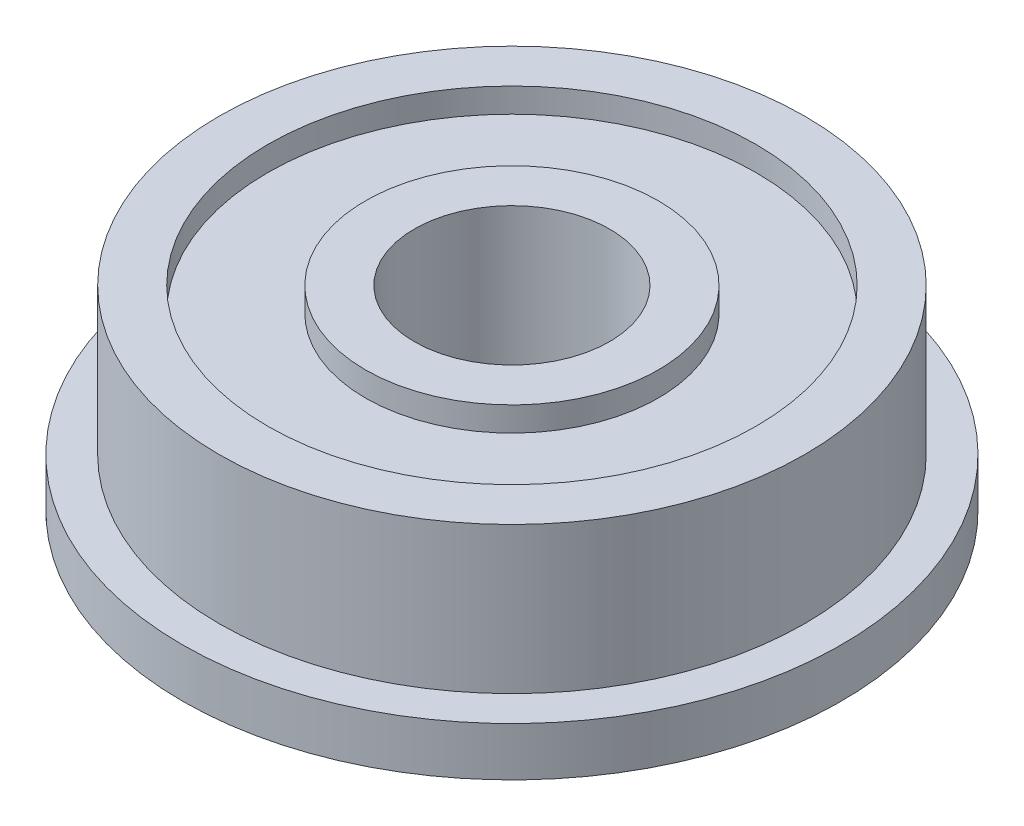
ISO-10303-21;
HEADER;
FILE_DESCRIPTION(('STEP AP214'),'2;1');
FILE_NAME('part.step','',(''),(''),'','','');
FILE_SCHEMA(('AUTOMOTIVE_DESIGN { 1 0 10303 214 1 1 1 1 }'));
ENDSEC;
DATA;
#1=APPLICATION_CONTEXT('core data for automotive mechanical design processes');
#2=APPLICATION_PROTOCOL_DEFINITION('international standard','automotive_design',2000,#1);
#3=PRODUCT_CONTEXT('',#1,'mechanical');
#4=PRODUCT('Part','Part','',(#3));
#5=PRODUCT_RELATED_PRODUCT_CATEGORY('part','',(#4));
#6=PRODUCT_DEFINITION_FORMATION('','',#4);
#7=PRODUCT_DEFINITION_CONTEXT('part definition',#1,'design');
#8=PRODUCT_DEFINITION('design','',#6,#7);
#9=PRODUCT_DEFINITION_SHAPE('','',#8);
#10=(LENGTH_UNIT() NAMED_UNIT(*) SI_UNIT(.MILLI.,.METRE.));
#11=(NAMED_UNIT(*) PLANE_ANGLE_UNIT() SI_UNIT($,.RADIAN.));
#12=(NAMED_UNIT(*) SI_UNIT($,.STERADIAN.) SOLID_ANGLE_UNIT());
#13=UNCERTAINTY_MEASURE_WITH_UNIT(LENGTH_MEASURE(1.E-05),#10,'distance_accuracy_value','');
#14=(GEOMETRIC_REPRESENTATION_CONTEXT(3) GLOBAL_UNCERTAINTY_ASSIGNED_CONTEXT((#13)) GLOBAL_UNIT_ASSIGNED_CONTEXT((#10,
#11,#12)) REPRESENTATION_CONTEXT('',''));
#15=CARTESIAN_POINT('',(0.,0.,0.));
#16=DIRECTION('',(0.,0.,1.));
#17=DIRECTION('',(1.,0.,0.));
#18=AXIS2_PLACEMENT_3D('',#15,#16,#17);
#19=CARTESIAN_POINT('',(0.,4000.,0.));
#20=DIRECTION('',(0.,1.,0.));
#21=DIRECTION('',(0.,0.,1.));
#22=AXIS2_PLACEMENT_3D('',#19,#20,#21);
#23=PLANE('',#22);
#24=CARTESIAN_POINT('',(0.,4000.,0.));
#25=DIRECTION('',(0.,1.,0.));
#26=DIRECTION('',(0.,0.,1.));
#27=AXIS2_PLACEMENT_3D('',#24,#25,#26);
#28=CIRCLE('',#27,2000.);
#29=CARTESIAN_POINT('',(0.,4000.,2000.));
#30=VERTEX_POINT('',#29);
#31=EDGE_CURVE('E41',#30,#30,#28,.T.);
#32=ORIENTED_EDGE('',*,*,#31,.F.);
#33=EDGE_LOOP('',(#32));
#34=FACE_BOUND('',#33,.T.);
#35=CARTESIAN_POINT('',(0.,4000.,0.));
#36=DIRECTION('',(0.,1.,0.));
#37=DIRECTION('',(0.,0.,1.));
#38=AXIS2_PLACEMENT_3D('',#35,#36,#37);
#39=CIRCLE('',#38,3000.);
#40=CARTESIAN_POINT('',(0.,4000.,3000.));
#41=VERTEX_POINT('',#40);
#42=EDGE_CURVE('E63',#41,#41,#39,.T.);
#43=ORIENTED_EDGE('',*,*,#42,.T.);
#44=EDGE_LOOP('',(#43));
#45=FACE_BOUND('',#44,.T.);
#46=ADVANCED_FACE('F33',(#34,#45),#23,.T.);
#47=CARTESIAN_POINT('',(0.,4000.,0.));
#48=DIRECTION('',(0.,-1.,0.));
#49=DIRECTION('',(0.,0.,-1.));
#50=AXIS2_PLACEMENT_3D('',#47,#48,#49);
#51=CYLINDRICAL_SURFACE('',#50,2000.);
#52=ORIENTED_EDGE('',*,*,#31,.T.);
#53=EDGE_LOOP('',(#52));
#54=FACE_BOUND('',#53,.T.);
#55=CARTESIAN_POINT('',(0.,0.,0.));
#56=DIRECTION('',(0.,1.,0.));
#57=DIRECTION('',(0.,0.,1.));
#58=AXIS2_PLACEMENT_3D('',#55,#56,#57);
#59=CIRCLE('',#58,2000.);
#60=CARTESIAN_POINT('',(0.,0.,2000.));
#61=VERTEX_POINT('',#60);
#62=EDGE_CURVE('E37',#61,#61,#59,.T.);
#63=ORIENTED_EDGE('',*,*,#62,.F.);
#64=EDGE_LOOP('',(#63));
#65=FACE_BOUND('',#64,.T.);
#66=ADVANCED_FACE('F35',(#54,#65),#51,.F.);
#67=CARTESIAN_POINT('',(0.,4000.,0.));
#68=DIRECTION('',(0.,-1.,0.));
#69=DIRECTION('',(0.,0.,-1.));
#70=AXIS2_PLACEMENT_3D('',#67,#68,#69);
#71=CYLINDRICAL_SURFACE('',#70,6000.);
#72=CARTESIAN_POINT('',(0.,1000.,0.));
#73=DIRECTION('',(0.,1.,0.));
#74=DIRECTION('',(0.,0.,1.));
#75=AXIS2_PLACEMENT_3D('',#72,#73,#74);
#76=CIRCLE('',#75,6000.);
#77=CARTESIAN_POINT('',(0.,1000.,6000.));
#78=VERTEX_POINT('',#77);
#79=EDGE_CURVE('E50',#78,#78,#76,.T.);
#80=ORIENTED_EDGE('',*,*,#79,.T.);
#81=EDGE_LOOP('',(#80));
#82=FACE_BOUND('',#81,.T.);
#83=CARTESIAN_POINT('',(0.,4000.,0.));
#84=DIRECTION('',(0.,1.,0.));
#85=DIRECTION('',(0.,0.,1.));
#86=AXIS2_PLACEMENT_3D('',#83,#84,#85);
#87=CIRCLE('',#86,6000.);
#88=CARTESIAN_POINT('',(0.,4000.,6000.));
#89=VERTEX_POINT('',#88);
#90=EDGE_CURVE('E10',#89,#89,#87,.T.);
#91=ORIENTED_EDGE('',*,*,#90,.F.);
#92=EDGE_LOOP('',(#91));
#93=FACE_BOUND('',#92,.T.);
#94=ADVANCED_FACE('F88',(#82,#93),#71,.T.);
#95=CARTESIAN_POINT('',(0.,4000.,0.));
#96=DIRECTION('',(0.,1.,0.));
#97=DIRECTION('',(0.,0.,1.));
#98=AXIS2_PLACEMENT_3D('',#95,#96,#97);
#99=CIRCLE('',#98,5000.);
#100=CARTESIAN_POINT('',(0.,4000.,5000.));
#101=VERTEX_POINT('',#100);
#102=EDGE_CURVE('E57',#101,#101,#99,.T.);
#103=ORIENTED_EDGE('',*,*,#102,.F.);
#104=EDGE_LOOP('',(#103));
#105=FACE_BOUND('',#104,.T.);
#106=ORIENTED_EDGE('',*,*,#90,.T.);
#107=EDGE_LOOP('',(#106));
#108=FACE_BOUND('',#107,.T.);
#109=ADVANCED_FACE('F85',(#105,#108),#23,.T.);
#110=CARTESIAN_POINT('',(0.,0.,0.));
#111=DIRECTION('',(0.,1.,0.));
#112=DIRECTION('',(0.,0.,1.));
#113=AXIS2_PLACEMENT_3D('',#110,#111,#112);
#114=PLANE('',#113);
#115=ORIENTED_EDGE('',*,*,#62,.T.);
#116=EDGE_LOOP('',(#115));
#117=FACE_BOUND('',#116,.T.);
#118=CARTESIAN_POINT('',(0.,0.,0.));
#119=DIRECTION('',(0.,1.,0.));
#120=DIRECTION('',(0.,0.,1.));
#121=AXIS2_PLACEMENT_3D('',#118,#119,#120);
#122=CIRCLE('',#121,6750.);
#123=CARTESIAN_POINT('',(0.,0.,6750.));
#124=VERTEX_POINT('',#123);
#125=EDGE_CURVE('E47',#124,#124,#122,.T.);
#126=ORIENTED_EDGE('',*,*,#125,.F.);
#127=EDGE_LOOP('',(#126));
#128=FACE_BOUND('',#127,.T.);
#129=ADVANCED_FACE('F87',(#117,#128),#114,.F.);
#130=CARTESIAN_POINT('',(0.,1000.,0.));
#131=DIRECTION('',(0.,-1.,0.));
#132=DIRECTION('',(0.,0.,-1.));
#133=AXIS2_PLACEMENT_3D('',#130,#131,#132);
#134=CYLINDRICAL_SURFACE('',#133,6750.);
#135=CARTESIAN_POINT('',(0.,1000.,0.));
#136=DIRECTION('',(0.,1.,0.));
#137=DIRECTION('',(0.,0.,1.));
#138=AXIS2_PLACEMENT_3D('',#135,#136,#137);
#139=CIRCLE('',#138,6750.);
#140=CARTESIAN_POINT('',(0.,1000.,6750.));
#141=VERTEX_POINT('',#140);
#142=EDGE_CURVE('E52',#141,#141,#139,.T.);
#143=ORIENTED_EDGE('',*,*,#142,.F.);
#144=EDGE_LOOP('',(#143));
#145=FACE_BOUND('',#144,.T.);
#146=ORIENTED_EDGE('',*,*,#125,.T.);
#147=EDGE_LOOP('',(#146));
#148=FACE_BOUND('',#147,.T.);
#149=ADVANCED_FACE('F94',(#145,#148),#134,.T.);
#150=CARTESIAN_POINT('',(0.,1000.,0.));
#151=DIRECTION('',(0.,1.,0.));
#152=DIRECTION('',(0.,0.,1.));
#153=AXIS2_PLACEMENT_3D('',#150,#151,#152);
#154=PLANE('',#153);
#155=ORIENTED_EDGE('',*,*,#79,.F.);
#156=EDGE_LOOP('',(#155));
#157=FACE_BOUND('',#156,.T.);
#158=ORIENTED_EDGE('',*,*,#142,.T.);
#159=EDGE_LOOP('',(#158));
#160=FACE_BOUND('',#159,.T.);
#161=ADVANCED_FACE('F81',(#157,#160),#154,.T.);
#162=CARTESIAN_POINT('',(0.,3500.,0.));
#163=DIRECTION('',(0.,1.,0.));
#164=DIRECTION('',(0.,0.,1.));
#165=AXIS2_PLACEMENT_3D('',#162,#163,#164);
#166=CYLINDRICAL_SURFACE('',#165,5000.);
#167=CARTESIAN_POINT('',(0.,3500.,0.));
#168=DIRECTION('',(0.,1.,0.));
#169=DIRECTION('',(0.,0.,1.));
#170=AXIS2_PLACEMENT_3D('',#167,#168,#169);
#171=CIRCLE('',#170,5000.);
#172=CARTESIAN_POINT('',(0.,3500.,5000.));
#173=VERTEX_POINT('',#172);
#174=EDGE_CURVE('E51',#173,#173,#171,.T.);
#175=ORIENTED_EDGE('',*,*,#174,.F.);
#176=EDGE_LOOP('',(#175));
#177=FACE_BOUND('',#176,.T.);
#178=ORIENTED_EDGE('',*,*,#102,.T.);
#179=EDGE_LOOP('',(#178));
#180=FACE_BOUND('',#179,.T.);
#181=ADVANCED_FACE('F75',(#177,#180),#166,.F.);
#182=CARTESIAN_POINT('',(0.,3500.,0.));
#183=DIRECTION('',(0.,1.,0.));
#184=DIRECTION('',(0.,0.,1.));
#185=AXIS2_PLACEMENT_3D('',#182,#183,#184);
#186=PLANE('',#185);
#187=CARTESIAN_POINT('',(0.,3500.,0.));
#188=DIRECTION('',(0.,1.,0.));
#189=DIRECTION('',(0.,0.,1.));
#190=AXIS2_PLACEMENT_3D('',#187,#188,#189);
#191=CIRCLE('',#190,3000.);
#192=CARTESIAN_POINT('',(0.,3500.,3000.));
#193=VERTEX_POINT('',#192);
#194=EDGE_CURVE('E60',#193,#193,#191,.T.);
#195=ORIENTED_EDGE('',*,*,#194,.F.);
#196=EDGE_LOOP('',(#195));
#197=FACE_BOUND('',#196,.T.);
#198=ORIENTED_EDGE('',*,*,#174,.T.);
#199=EDGE_LOOP('',(#198));
#200=FACE_BOUND('',#199,.T.);
#201=ADVANCED_FACE('F72',(#197,#200),#186,.T.);
#202=CARTESIAN_POINT('',(0.,3500.,0.));
#203=DIRECTION('',(0.,1.,0.));
#204=DIRECTION('',(0.,0.,1.));
#205=AXIS2_PLACEMENT_3D('',#202,#203,#204);
#206=CYLINDRICAL_SURFACE('',#205,3000.);
#207=ORIENTED_EDGE('',*,*,#194,.T.);
#208=EDGE_LOOP('',(#207));
#209=FACE_BOUND('',#208,.T.);
#210=ORIENTED_EDGE('',*,*,#42,.F.);
#211=EDGE_LOOP('',(#210));
#212=FACE_BOUND('',#211,.T.);
#213=ADVANCED_FACE('F69',(#209,#212),#206,.T.);
#214=CLOSED_SHELL('',(#46,#66,#94,#109,#129,#149,#161,#181,#201,#213));
#215=MANIFOLD_SOLID_BREP('B2',#214);
#216=ADVANCED_BREP_SHAPE_REPRESENTATION('',(#18,#215),#14);
#217=SHAPE_DEFINITION_REPRESENTATION(#9,#216);
ENDSEC;
END-ISO-10303-21;
